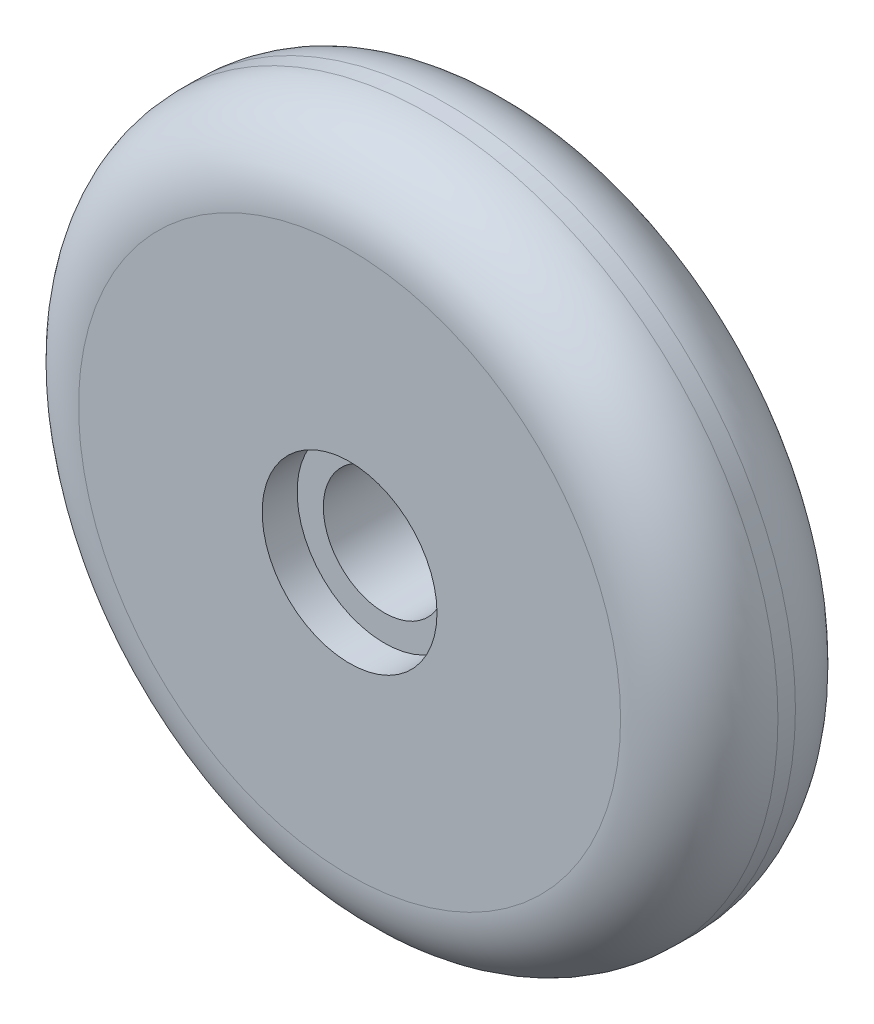
ISO-10303-21;
HEADER;
FILE_DESCRIPTION(('STEP AP214'),'2;1');
FILE_NAME('part.step','',(''),(''),'','','');
FILE_SCHEMA(('AUTOMOTIVE_DESIGN { 1 0 10303 214 1 1 1 1 }'));
ENDSEC;
DATA;
#1=APPLICATION_CONTEXT('core data for automotive mechanical design processes');
#2=APPLICATION_PROTOCOL_DEFINITION('international standard','automotive_design',2000,#1);
#3=PRODUCT_CONTEXT('',#1,'mechanical');
#4=PRODUCT('Part','Part','',(#3));
#5=PRODUCT_RELATED_PRODUCT_CATEGORY('part','',(#4));
#6=PRODUCT_DEFINITION_FORMATION('','',#4);
#7=PRODUCT_DEFINITION_CONTEXT('part definition',#1,'design');
#8=PRODUCT_DEFINITION('design','',#6,#7);
#9=PRODUCT_DEFINITION_SHAPE('','',#8);
#10=(LENGTH_UNIT() NAMED_UNIT(*) SI_UNIT(.MILLI.,.METRE.));
#11=(NAMED_UNIT(*) PLANE_ANGLE_UNIT() SI_UNIT($,.RADIAN.));
#12=(NAMED_UNIT(*) SI_UNIT($,.STERADIAN.) SOLID_ANGLE_UNIT());
#13=UNCERTAINTY_MEASURE_WITH_UNIT(LENGTH_MEASURE(1.E-05),#10,'distance_accuracy_value','');
#14=(GEOMETRIC_REPRESENTATION_CONTEXT(3) GLOBAL_UNCERTAINTY_ASSIGNED_CONTEXT((#13)) GLOBAL_UNIT_ASSIGNED_CONTEXT((#10,
#11,#12)) REPRESENTATION_CONTEXT('',''));
#15=CARTESIAN_POINT('',(0.,0.,0.));
#16=DIRECTION('',(0.,0.,1.));
#17=DIRECTION('',(1.,0.,0.));
#18=AXIS2_PLACEMENT_3D('',#15,#16,#17);
#19=CARTESIAN_POINT('',(0.,0.,10.));
#20=DIRECTION('',(0.,0.,-1.));
#21=DIRECTION('',(-1.,0.,0.));
#22=AXIS2_PLACEMENT_3D('',#19,#20,#21);
#23=CYLINDRICAL_SURFACE('',#22,3.5);
#24=CARTESIAN_POINT('',(0.,0.,2.));
#25=DIRECTION('',(0.,0.,-1.));
#26=DIRECTION('',(-1.,0.,0.));
#27=AXIS2_PLACEMENT_3D('',#24,#25,#26);
#28=CIRCLE('',#27,3.5);
#29=CARTESIAN_POINT('',(-3.5,0.,2.));
#30=VERTEX_POINT('',#29);
#31=EDGE_CURVE('E61',#30,#30,#28,.T.);
#32=ORIENTED_EDGE('',*,*,#31,.T.);
#33=EDGE_LOOP('',(#32));
#34=FACE_BOUND('',#33,.T.);
#35=CARTESIAN_POINT('',(0.,0.,8.));
#36=DIRECTION('',(0.,0.,1.));
#37=DIRECTION('',(1.,0.,0.));
#38=AXIS2_PLACEMENT_3D('',#35,#36,#37);
#39=CIRCLE('',#38,3.5);
#40=CARTESIAN_POINT('',(3.5,0.,8.));
#41=VERTEX_POINT('',#40);
#42=EDGE_CURVE('E47',#41,#41,#39,.T.);
#43=ORIENTED_EDGE('',*,*,#42,.T.);
#44=EDGE_LOOP('',(#43));
#45=FACE_BOUND('',#44,.T.);
#46=ADVANCED_FACE('F43',(#34,#45),#23,.F.);
#47=CARTESIAN_POINT('',(0.,0.,10.));
#48=DIRECTION('',(0.,0.,1.));
#49=DIRECTION('',(1.,0.,0.));
#50=AXIS2_PLACEMENT_3D('',#47,#48,#49);
#51=PLANE('',#50);
#52=CARTESIAN_POINT('',(0.,0.,10.));
#53=DIRECTION('',(0.,0.,1.));
#54=DIRECTION('',(1.,0.,0.));
#55=AXIS2_PLACEMENT_3D('',#52,#53,#54);
#56=CIRCLE('',#55,5.);
#57=CARTESIAN_POINT('',(5.,0.,10.));
#58=VERTEX_POINT('',#57);
#59=EDGE_CURVE('E81',#58,#58,#56,.T.);
#60=ORIENTED_EDGE('',*,*,#59,.F.);
#61=EDGE_LOOP('',(#60));
#62=FACE_BOUND('',#61,.T.);
#63=CARTESIAN_POINT('',(0.,0.,10.));
#64=DIRECTION('',(0.,0.,1.));
#65=DIRECTION('',(1.,0.,0.));
#66=AXIS2_PLACEMENT_3D('',#63,#64,#65);
#67=CIRCLE('',#66,15.5);
#68=CARTESIAN_POINT('',(15.5,0.,10.));
#69=VERTEX_POINT('',#68);
#70=EDGE_CURVE('E10',#69,#69,#67,.T.);
#71=ORIENTED_EDGE('',*,*,#70,.T.);
#72=EDGE_LOOP('',(#71));
#73=FACE_BOUND('',#72,.T.);
#74=ADVANCED_FACE('F103',(#62,#73),#51,.T.);
#75=CARTESIAN_POINT('',(0.,0.,0.));
#76=DIRECTION('',(0.,0.,1.));
#77=DIRECTION('',(1.,0.,0.));
#78=AXIS2_PLACEMENT_3D('',#75,#76,#77);
#79=PLANE('',#78);
#80=CARTESIAN_POINT('',(0.,0.,0.));
#81=DIRECTION('',(0.,0.,-1.));
#82=DIRECTION('',(-1.,0.,0.));
#83=AXIS2_PLACEMENT_3D('',#80,#81,#82);
#84=CIRCLE('',#83,5.);
#85=CARTESIAN_POINT('',(-5.,0.,0.));
#86=VERTEX_POINT('',#85);
#87=EDGE_CURVE('E73',#86,#86,#84,.T.);
#88=ORIENTED_EDGE('',*,*,#87,.F.);
#89=EDGE_LOOP('',(#88));
#90=FACE_BOUND('',#89,.T.);
#91=CARTESIAN_POINT('',(0.,0.,0.));
#92=DIRECTION('',(0.,0.,1.));
#93=DIRECTION('',(1.,0.,0.));
#94=AXIS2_PLACEMENT_3D('',#91,#92,#93);
#95=CIRCLE('',#94,15.5);
#96=CARTESIAN_POINT('',(15.5,0.,0.));
#97=VERTEX_POINT('',#96);
#98=EDGE_CURVE('E52',#97,#97,#95,.F.);
#99=ORIENTED_EDGE('',*,*,#98,.T.);
#100=EDGE_LOOP('',(#99));
#101=FACE_BOUND('',#100,.T.);
#102=ADVANCED_FACE('F99',(#90,#101),#79,.F.);
#103=CARTESIAN_POINT('',(0.,0.,10.));
#104=DIRECTION('',(0.,0.,-1.));
#105=DIRECTION('',(-1.,0.,0.));
#106=AXIS2_PLACEMENT_3D('',#103,#104,#105);
#107=CYLINDRICAL_SURFACE('',#106,20.);
#108=CARTESIAN_POINT('',(0.,0.,4.5));
#109=DIRECTION('',(0.,0.,1.));
#110=DIRECTION('',(1.,0.,0.));
#111=AXIS2_PLACEMENT_3D('',#108,#109,#110);
#112=CIRCLE('',#111,20.);
#113=CARTESIAN_POINT('',(20.,0.,4.5));
#114=VERTEX_POINT('',#113);
#115=EDGE_CURVE('E58',#114,#114,#112,.T.);
#116=ORIENTED_EDGE('',*,*,#115,.T.);
#117=EDGE_LOOP('',(#116));
#118=FACE_BOUND('',#117,.T.);
#119=CARTESIAN_POINT('',(0.,0.,5.5));
#120=DIRECTION('',(0.,0.,1.));
#121=DIRECTION('',(1.,0.,0.));
#122=AXIS2_PLACEMENT_3D('',#119,#120,#121);
#123=CIRCLE('',#122,20.);
#124=CARTESIAN_POINT('',(20.,0.,5.5));
#125=VERTEX_POINT('',#124);
#126=EDGE_CURVE('E64',#125,#125,#123,.F.);
#127=ORIENTED_EDGE('',*,*,#126,.T.);
#128=EDGE_LOOP('',(#127));
#129=FACE_BOUND('',#128,.T.);
#130=ADVANCED_FACE('F87',(#118,#129),#107,.T.);
#131=CARTESIAN_POINT('',(0.,0.,4.5));
#132=DIRECTION('',(0.,0.,1.));
#133=DIRECTION('',(1.,0.,0.));
#134=AXIS2_PLACEMENT_3D('',#131,#132,#133);
#135=TOROIDAL_SURFACE('',#134,15.5,4.5);
#136=ORIENTED_EDGE('',*,*,#98,.F.);
#137=EDGE_LOOP('',(#136));
#138=FACE_BOUND('',#137,.T.);
#139=ORIENTED_EDGE('',*,*,#115,.F.);
#140=EDGE_LOOP('',(#139));
#141=FACE_BOUND('',#140,.T.);
#142=ADVANCED_FACE('F90',(#138,#141),#135,.T.);
#143=CARTESIAN_POINT('',(0.,0.,5.5));
#144=DIRECTION('',(0.,0.,1.));
#145=DIRECTION('',(1.,0.,0.));
#146=AXIS2_PLACEMENT_3D('',#143,#144,#145);
#147=TOROIDAL_SURFACE('',#146,15.5,4.5);
#148=ORIENTED_EDGE('',*,*,#126,.F.);
#149=EDGE_LOOP('',(#148));
#150=FACE_BOUND('',#149,.T.);
#151=ORIENTED_EDGE('',*,*,#70,.F.);
#152=EDGE_LOOP('',(#151));
#153=FACE_BOUND('',#152,.T.);
#154=ADVANCED_FACE('F45',(#150,#153),#147,.T.);
#155=CARTESIAN_POINT('',(0.,0.,2.));
#156=DIRECTION('',(0.,0.,-1.));
#157=DIRECTION('',(-1.,0.,0.));
#158=AXIS2_PLACEMENT_3D('',#155,#156,#157);
#159=CYLINDRICAL_SURFACE('',#158,5.);
#160=CARTESIAN_POINT('',(0.,0.,2.));
#161=DIRECTION('',(0.,0.,-1.));
#162=DIRECTION('',(-1.,0.,0.));
#163=AXIS2_PLACEMENT_3D('',#160,#161,#162);
#164=CIRCLE('',#163,5.);
#165=CARTESIAN_POINT('',(-5.,0.,2.));
#166=VERTEX_POINT('',#165);
#167=EDGE_CURVE('E65',#166,#166,#164,.T.);
#168=ORIENTED_EDGE('',*,*,#167,.F.);
#169=EDGE_LOOP('',(#168));
#170=FACE_BOUND('',#169,.T.);
#171=ORIENTED_EDGE('',*,*,#87,.T.);
#172=EDGE_LOOP('',(#171));
#173=FACE_BOUND('',#172,.T.);
#174=ADVANCED_FACE('F97',(#170,#173),#159,.F.);
#175=CARTESIAN_POINT('',(0.,0.,2.));
#176=DIRECTION('',(0.,0.,-1.));
#177=DIRECTION('',(-1.,0.,0.));
#178=AXIS2_PLACEMENT_3D('',#175,#176,#177);
#179=PLANE('',#178);
#180=ORIENTED_EDGE('',*,*,#31,.F.);
#181=EDGE_LOOP('',(#180));
#182=FACE_BOUND('',#181,.T.);
#183=ORIENTED_EDGE('',*,*,#167,.T.);
#184=EDGE_LOOP('',(#183));
#185=FACE_BOUND('',#184,.T.);
#186=ADVANCED_FACE('F123',(#182,#185),#179,.T.);
#187=CARTESIAN_POINT('',(0.,0.,8.));
#188=DIRECTION('',(0.,0.,1.));
#189=DIRECTION('',(1.,0.,0.));
#190=AXIS2_PLACEMENT_3D('',#187,#188,#189);
#191=CYLINDRICAL_SURFACE('',#190,5.);
#192=CARTESIAN_POINT('',(0.,0.,8.));
#193=DIRECTION('',(0.,0.,1.));
#194=DIRECTION('',(1.,0.,0.));
#195=AXIS2_PLACEMENT_3D('',#192,#193,#194);
#196=CIRCLE('',#195,5.);
#197=CARTESIAN_POINT('',(5.,0.,8.));
#198=VERTEX_POINT('',#197);
#199=EDGE_CURVE('E145',#198,#198,#196,.T.);
#200=ORIENTED_EDGE('',*,*,#199,.F.);
#201=EDGE_LOOP('',(#200));
#202=FACE_BOUND('',#201,.T.);
#203=ORIENTED_EDGE('',*,*,#59,.T.);
#204=EDGE_LOOP('',(#203));
#205=FACE_BOUND('',#204,.T.);
#206=ADVANCED_FACE('F127',(#202,#205),#191,.F.);
#207=CARTESIAN_POINT('',(0.,0.,8.));
#208=DIRECTION('',(0.,0.,1.));
#209=DIRECTION('',(1.,0.,0.));
#210=AXIS2_PLACEMENT_3D('',#207,#208,#209);
#211=PLANE('',#210);
#212=ORIENTED_EDGE('',*,*,#42,.F.);
#213=EDGE_LOOP('',(#212));
#214=FACE_BOUND('',#213,.T.);
#215=ORIENTED_EDGE('',*,*,#199,.T.);
#216=EDGE_LOOP('',(#215));
#217=FACE_BOUND('',#216,.T.);
#218=ADVANCED_FACE('F132',(#214,#217),#211,.T.);
#219=CLOSED_SHELL('',(#46,#74,#102,#130,#142,#154,#174,#186,#206,#218));
#220=MANIFOLD_SOLID_BREP('B2',#219);
#221=ADVANCED_BREP_SHAPE_REPRESENTATION('',(#18,#220),#14);
#222=SHAPE_DEFINITION_REPRESENTATION(#9,#221);
ENDSEC;
END-ISO-10303-21;
